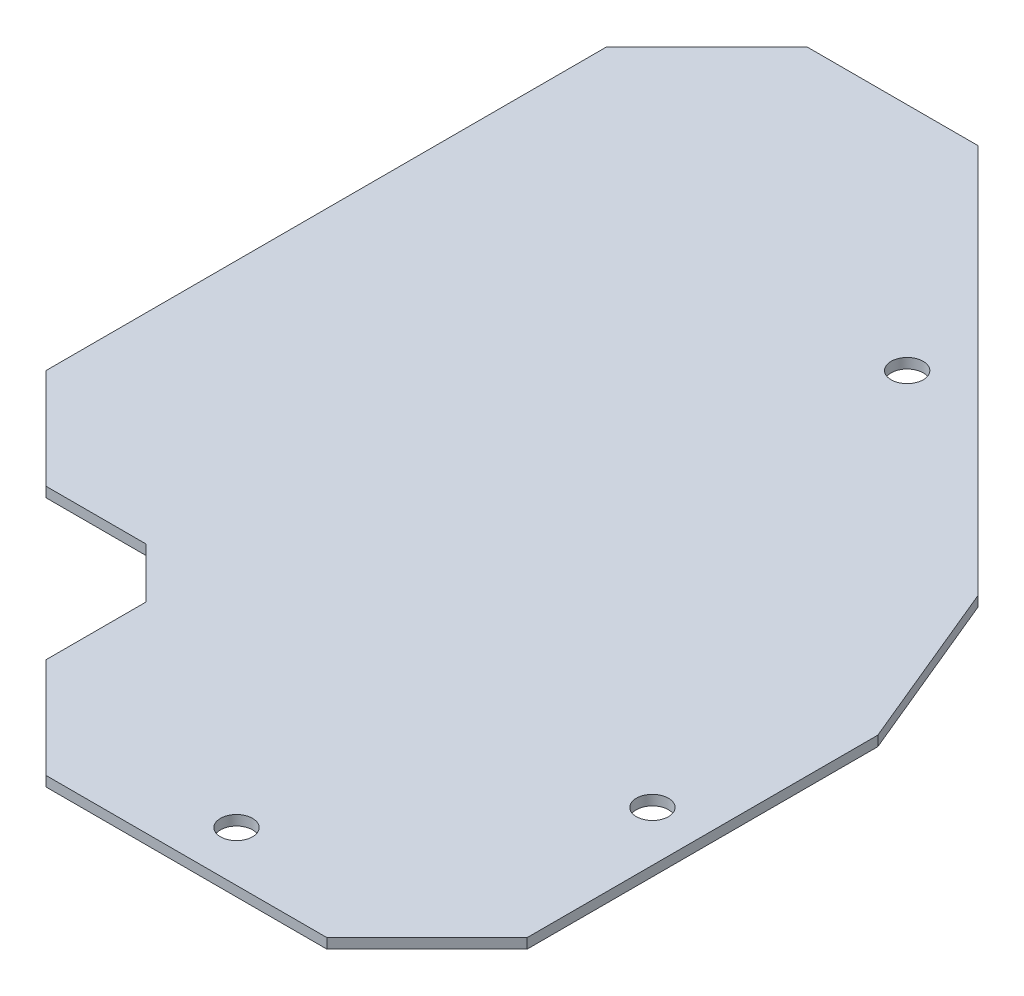
ISO-10303-21;
HEADER;
FILE_DESCRIPTION(('STEP AP214'),'2;1');
FILE_NAME('part.step','',(''),(''),'','','');
FILE_SCHEMA(('AUTOMOTIVE_DESIGN { 1 0 10303 214 1 1 1 1 }'));
ENDSEC;
DATA;
#1=APPLICATION_CONTEXT('core data for automotive mechanical design processes');
#2=APPLICATION_PROTOCOL_DEFINITION('international standard','automotive_design',2000,#1);
#3=PRODUCT_CONTEXT('',#1,'mechanical');
#4=PRODUCT('Part','Part','',(#3));
#5=PRODUCT_RELATED_PRODUCT_CATEGORY('part','',(#4));
#6=PRODUCT_DEFINITION_FORMATION('','',#4);
#7=PRODUCT_DEFINITION_CONTEXT('part definition',#1,'design');
#8=PRODUCT_DEFINITION('design','',#6,#7);
#9=PRODUCT_DEFINITION_SHAPE('','',#8);
#10=(LENGTH_UNIT() NAMED_UNIT(*) SI_UNIT(.MILLI.,.METRE.));
#11=(NAMED_UNIT(*) PLANE_ANGLE_UNIT() SI_UNIT($,.RADIAN.));
#12=(NAMED_UNIT(*) SI_UNIT($,.STERADIAN.) SOLID_ANGLE_UNIT());
#13=UNCERTAINTY_MEASURE_WITH_UNIT(LENGTH_MEASURE(1.E-05),#10,'distance_accuracy_value','');
#14=(GEOMETRIC_REPRESENTATION_CONTEXT(3) GLOBAL_UNCERTAINTY_ASSIGNED_CONTEXT((#13)) GLOBAL_UNIT_ASSIGNED_CONTEXT((#10,
#11,#12)) REPRESENTATION_CONTEXT('',''));
#15=CARTESIAN_POINT('',(0.,0.,0.));
#16=DIRECTION('',(0.,0.,1.));
#17=DIRECTION('',(1.,0.,0.));
#18=AXIS2_PLACEMENT_3D('',#15,#16,#17);
#19=CARTESIAN_POINT('',(0.,1.,0.));
#20=DIRECTION('',(0.,0.,-1.));
#21=DIRECTION('',(-1.,0.,0.));
#22=AXIS2_PLACEMENT_3D('',#19,#20,#21);
#23=PLANE('',#22);
#24=DIRECTION('',(1.,0.,0.));
#25=VECTOR('',#24,1.);
#26=CARTESIAN_POINT('',(0.,1.,0.));
#27=LINE('',#26,#25);
#28=CARTESIAN_POINT('',(15.,1.,0.));
#29=VERTEX_POINT('',#28);
#30=CARTESIAN_POINT('',(43.0330085889908,1.,0.));
#31=VERTEX_POINT('',#30);
#32=EDGE_CURVE('E230',#29,#31,#27,.T.);
#33=ORIENTED_EDGE('',*,*,#32,.F.);
#34=DIRECTION('',(0.,-1.,0.));
#35=VECTOR('',#34,1.);
#36=CARTESIAN_POINT('',(15.,1.,0.));
#37=LINE('',#36,#35);
#38=CARTESIAN_POINT('',(15.,0.,0.));
#39=VERTEX_POINT('',#38);
#40=EDGE_CURVE('E262',#29,#39,#37,.T.);
#41=ORIENTED_EDGE('',*,*,#40,.T.);
#42=DIRECTION('',(1.,0.,0.));
#43=VECTOR('',#42,1.);
#44=CARTESIAN_POINT('',(0.,0.,0.));
#45=LINE('',#44,#43);
#46=CARTESIAN_POINT('',(43.0330085889908,0.,0.));
#47=VERTEX_POINT('',#46);
#48=EDGE_CURVE('E226',#39,#47,#45,.T.);
#49=ORIENTED_EDGE('',*,*,#48,.T.);
#50=DIRECTION('',(0.,1.,0.));
#51=VECTOR('',#50,1.);
#52=CARTESIAN_POINT('',(43.0330085889908,1.,0.));
#53=LINE('',#52,#51);
#54=EDGE_CURVE('E257',#47,#31,#53,.T.);
#55=ORIENTED_EDGE('',*,*,#54,.T.);
#56=EDGE_LOOP('',(#33,#41,#49,#55));
#57=FACE_BOUND('',#56,.T.);
#58=ADVANCED_FACE('F43',(#57),#23,.F.);
#59=CARTESIAN_POINT('',(53.0330085889908,1.,0.));
#60=DIRECTION('',(-1.,0.,0.));
#61=DIRECTION('',(0.,0.,1.));
#62=AXIS2_PLACEMENT_3D('',#59,#60,#61);
#63=PLANE('',#62);
#64=DIRECTION('',(0.,0.,-1.));
#65=VECTOR('',#64,1.);
#66=CARTESIAN_POINT('',(53.0330085889908,0.,0.));
#67=LINE('',#66,#65);
#68=CARTESIAN_POINT('',(53.0330085889908,0.,-10.));
#69=VERTEX_POINT('',#68);
#70=CARTESIAN_POINT('',(53.0330085889908,0.,-44.9999999999999));
#71=VERTEX_POINT('',#70);
#72=EDGE_CURVE('E241',#69,#71,#67,.T.);
#73=ORIENTED_EDGE('',*,*,#72,.T.);
#74=DIRECTION('',(0.,1.,0.));
#75=VECTOR('',#74,1.);
#76=CARTESIAN_POINT('',(53.0330085889908,1.,-44.9999999999999));
#77=LINE('',#76,#75);
#78=CARTESIAN_POINT('',(53.0330085889908,1.,-44.9999999999999));
#79=VERTEX_POINT('',#78);
#80=EDGE_CURVE('E174',#71,#79,#77,.T.);
#81=ORIENTED_EDGE('',*,*,#80,.T.);
#82=DIRECTION('',(0.,0.,-1.));
#83=VECTOR('',#82,1.);
#84=CARTESIAN_POINT('',(53.0330085889908,1.,0.));
#85=LINE('',#84,#83);
#86=CARTESIAN_POINT('',(53.0330085889908,1.,-10.));
#87=VERTEX_POINT('',#86);
#88=EDGE_CURVE('E235',#87,#79,#85,.T.);
#89=ORIENTED_EDGE('',*,*,#88,.F.);
#90=DIRECTION('',(0.,-1.,0.));
#91=VECTOR('',#90,1.);
#92=CARTESIAN_POINT('',(53.0330085889908,1.,-10.));
#93=LINE('',#92,#91);
#94=EDGE_CURVE('E170',#87,#69,#93,.T.);
#95=ORIENTED_EDGE('',*,*,#94,.T.);
#96=EDGE_LOOP('',(#73,#81,#89,#95));
#97=FACE_BOUND('',#96,.T.);
#98=ADVANCED_FACE('F275',(#97),#63,.F.);
#99=CARTESIAN_POINT('',(53.0330085889908,1.,-55.));
#100=DIRECTION('',(-0.707106781186552,0.,0.707106781186544));
#101=DIRECTION('',(0.707106781186544,0.,0.707106781186552));
#102=AXIS2_PLACEMENT_3D('',#99,#100,#101);
#103=PLANE('',#102);
#104=DIRECTION('',(-0.707106781186544,0.,-0.707106781186552));
#105=VECTOR('',#104,1.);
#106=CARTESIAN_POINT('',(53.0330085889908,1.,-55.));
#107=LINE('',#106,#105);
#108=CARTESIAN_POINT('',(45.9619407771253,1.,-62.0710678118656));
#109=VERTEX_POINT('',#108);
#110=CARTESIAN_POINT('',(7.07106781186549,1.,-100.961940777126));
#111=VERTEX_POINT('',#110);
#112=EDGE_CURVE('E236',#109,#111,#107,.T.);
#113=ORIENTED_EDGE('',*,*,#112,.F.);
#114=DIRECTION('',(0.,-1.,0.));
#115=VECTOR('',#114,1.);
#116=CARTESIAN_POINT('',(45.9619407771253,1.,-62.0710678118656));
#117=LINE('',#116,#115);
#118=CARTESIAN_POINT('',(45.9619407771253,0.,-62.0710678118656));
#119=VERTEX_POINT('',#118);
#120=EDGE_CURVE('E147',#109,#119,#117,.T.);
#121=ORIENTED_EDGE('',*,*,#120,.T.);
#122=DIRECTION('',(-0.707106781186544,0.,-0.707106781186552));
#123=VECTOR('',#122,1.);
#124=CARTESIAN_POINT('',(53.0330085889908,0.,-55.));
#125=LINE('',#124,#123);
#126=CARTESIAN_POINT('',(7.07106781186549,0.,-100.961940777126));
#127=VERTEX_POINT('',#126);
#128=EDGE_CURVE('E231',#119,#127,#125,.T.);
#129=ORIENTED_EDGE('',*,*,#128,.T.);
#130=DIRECTION('',(0.,1.,0.));
#131=VECTOR('',#130,1.);
#132=CARTESIAN_POINT('',(7.07106781186549,1.,-100.961940777126));
#133=LINE('',#132,#131);
#134=EDGE_CURVE('E252',#127,#111,#133,.T.);
#135=ORIENTED_EDGE('',*,*,#134,.T.);
#136=EDGE_LOOP('',(#113,#121,#129,#135));
#137=FACE_BOUND('',#136,.T.);
#138=ADVANCED_FACE('F283',(#137),#103,.F.);
#139=CARTESIAN_POINT('',(0.,1.,0.));
#140=DIRECTION('',(0.,1.,0.));
#141=DIRECTION('',(0.,0.,1.));
#142=AXIS2_PLACEMENT_3D('',#139,#140,#141);
#143=PLANE('',#142);
#144=CARTESIAN_POINT('',(22.9809703885626,0.999999999999999,-77.980970388563));
#145=DIRECTION('',(0.,1.,0.));
#146=DIRECTION('',(0.,0.,1.));
#147=AXIS2_PLACEMENT_3D('',#144,#145,#146);
#148=CIRCLE('',#147,1.6);
#149=CARTESIAN_POINT('',(22.9809703885626,0.999999999999999,-76.380970388563));
#150=VERTEX_POINT('',#149);
#151=EDGE_CURVE('E220',#150,#150,#148,.T.);
#152=ORIENTED_EDGE('',*,*,#151,.F.);
#153=EDGE_LOOP('',(#152));
#154=FACE_BOUND('',#153,.T.);
#155=CARTESIAN_POINT('',(48.0330085889908,0.999999999999999,-27.5));
#156=DIRECTION('',(0.,1.,0.));
#157=DIRECTION('',(0.,0.,1.));
#158=AXIS2_PLACEMENT_3D('',#155,#156,#157);
#159=CIRCLE('',#158,1.6);
#160=CARTESIAN_POINT('',(48.0330085889908,0.999999999999999,-25.9));
#161=VERTEX_POINT('',#160);
#162=EDGE_CURVE('E217',#161,#161,#159,.T.);
#163=ORIENTED_EDGE('',*,*,#162,.F.);
#164=EDGE_LOOP('',(#163));
#165=FACE_BOUND('',#164,.T.);
#166=CARTESIAN_POINT('',(29.0165042944954,0.999999999999999,-5.));
#167=DIRECTION('',(0.,1.,0.));
#168=DIRECTION('',(0.,0.,1.));
#169=AXIS2_PLACEMENT_3D('',#166,#167,#168);
#170=CIRCLE('',#169,1.6);
#171=CARTESIAN_POINT('',(29.0165042944954,0.999999999999999,-3.4));
#172=VERTEX_POINT('',#171);
#173=EDGE_CURVE('E209',#172,#172,#170,.T.);
#174=ORIENTED_EDGE('',*,*,#173,.F.);
#175=EDGE_LOOP('',(#174));
#176=FACE_BOUND('',#175,.T.);
#177=DIRECTION('',(0.,0.,-1.));
#178=VECTOR('',#177,1.);
#179=CARTESIAN_POINT('',(-20.,1.,-100.961940777126));
#180=LINE('',#179,#178);
#181=CARTESIAN_POINT('',(-20.,1.,-34.9999999999999));
#182=VERTEX_POINT('',#181);
#183=CARTESIAN_POINT('',(-20.,1.,-90.9619407771256));
#184=VERTEX_POINT('',#183);
#185=EDGE_CURVE('E156',#182,#184,#180,.T.);
#186=ORIENTED_EDGE('',*,*,#185,.F.);
#187=DIRECTION('',(-0.707106781186546,0.,-0.707106781186549));
#188=VECTOR('',#187,1.);
#189=CARTESIAN_POINT('',(7.49999999999994,1.,-7.49999999999991));
#190=LINE('',#189,#188);
#191=CARTESIAN_POINT('',(-9.99999999999996,1.,-24.9999999999999));
#192=VERTEX_POINT('',#191);
#193=EDGE_CURVE('E55',#182,#192,#190,.F.);
#194=ORIENTED_EDGE('',*,*,#193,.T.);
#195=DIRECTION('',(-1.,0.,0.));
#196=VECTOR('',#195,1.);
#197=CARTESIAN_POINT('',(0.,1.,-24.9999999999999));
#198=LINE('',#197,#196);
#199=CARTESIAN_POINT('',(0.,1.,-24.9999999999999));
#200=VERTEX_POINT('',#199);
#201=EDGE_CURVE('E154',#200,#192,#198,.T.);
#202=ORIENTED_EDGE('',*,*,#201,.F.);
#203=DIRECTION('',(-0.707106781186544,0.,-0.707106781186551));
#204=VECTOR('',#203,1.);
#205=CARTESIAN_POINT('',(5.,0.999999999999999,-19.9999999999998));
#206=LINE('',#205,#204);
#207=CARTESIAN_POINT('',(5.,1.,-19.9999999999998));
#208=VERTEX_POINT('',#207);
#209=EDGE_CURVE('E138',#200,#208,#206,.F.);
#210=ORIENTED_EDGE('',*,*,#209,.T.);
#211=DIRECTION('',(0.,0.,-1.));
#212=VECTOR('',#211,1.);
#213=CARTESIAN_POINT('',(5.,1.,0.));
#214=LINE('',#213,#212);
#215=CARTESIAN_POINT('',(5.,1.,-10.));
#216=VERTEX_POINT('',#215);
#217=EDGE_CURVE('E228',#216,#208,#214,.T.);
#218=ORIENTED_EDGE('',*,*,#217,.F.);
#219=DIRECTION('',(-0.707106781186547,0.,-0.707106781186549));
#220=VECTOR('',#219,1.);
#221=CARTESIAN_POINT('',(7.50000000000002,1.,-7.5));
#222=LINE('',#221,#220);
#223=EDGE_CURVE('E259',#216,#29,#222,.F.);
#224=ORIENTED_EDGE('',*,*,#223,.T.);
#225=ORIENTED_EDGE('',*,*,#32,.T.);
#226=DIRECTION('',(-0.707106781186549,0.,0.707106781186547));
#227=VECTOR('',#226,1.);
#228=CARTESIAN_POINT('',(21.5165042944953,1.,21.5165042944954));
#229=LINE('',#228,#227);
#230=EDGE_CURVE('E251',#31,#87,#229,.F.);
#231=ORIENTED_EDGE('',*,*,#230,.T.);
#232=ORIENTED_EDGE('',*,*,#88,.T.);
#233=DIRECTION('',(0.382683432365086,0.,0.923879532511288));
#234=VECTOR('',#233,1.);
#235=CARTESIAN_POINT('',(61.1764068711926,1.,-25.3400974233023));
#236=LINE('',#235,#234);
#237=EDGE_CURVE('E180',#79,#109,#236,.F.);
#238=ORIENTED_EDGE('',*,*,#237,.T.);
#239=ORIENTED_EDGE('',*,*,#112,.T.);
#240=DIRECTION('',(1.,0.,0.));
#241=VECTOR('',#240,1.);
#242=CARTESIAN_POINT('',(-1.18889686371183E-12,1.,-100.961940777126));
#243=LINE('',#242,#241);
#244=CARTESIAN_POINT('',(-10.0000000000002,1.,-100.961940777126));
#245=VERTEX_POINT('',#244);
#246=EDGE_CURVE('E260',#111,#245,#243,.F.);
#247=ORIENTED_EDGE('',*,*,#246,.T.);
#248=DIRECTION('',(-0.707106781186541,0.,0.707106781186554));
#249=VECTOR('',#248,1.);
#250=CARTESIAN_POINT('',(-55.480970388563,1.,-55.4809703885619));
#251=LINE('',#250,#249);
#252=EDGE_CURVE('E63',#245,#184,#251,.T.);
#253=ORIENTED_EDGE('',*,*,#252,.T.);
#254=EDGE_LOOP('',(#186,#194,#202,#210,#218,#224,#225,#231,#232,#238,#239,#247,#253));
#255=FACE_BOUND('',#254,.T.);
#256=ADVANCED_FACE('F153',(#154,#165,#176,#255),#143,.T.);
#257=CARTESIAN_POINT('',(0.,0.,0.));
#258=DIRECTION('',(0.,1.,0.));
#259=DIRECTION('',(0.,0.,1.));
#260=AXIS2_PLACEMENT_3D('',#257,#258,#259);
#261=PLANE('',#260);
#262=CARTESIAN_POINT('',(22.9809703885626,0.,-77.980970388563));
#263=DIRECTION('',(0.,-1.,0.));
#264=DIRECTION('',(0.,0.,-1.));
#265=AXIS2_PLACEMENT_3D('',#262,#263,#264);
#266=CIRCLE('',#265,1.6);
#267=CARTESIAN_POINT('',(22.9809703885626,0.,-79.580970388563));
#268=VERTEX_POINT('',#267);
#269=EDGE_CURVE('E207',#268,#268,#266,.T.);
#270=ORIENTED_EDGE('',*,*,#269,.F.);
#271=EDGE_LOOP('',(#270));
#272=FACE_BOUND('',#271,.T.);
#273=CARTESIAN_POINT('',(48.0330085889908,0.,-27.5));
#274=DIRECTION('',(0.,-1.,0.));
#275=DIRECTION('',(0.,0.,-1.));
#276=AXIS2_PLACEMENT_3D('',#273,#274,#275);
#277=CIRCLE('',#276,1.6);
#278=CARTESIAN_POINT('',(48.0330085889908,0.,-29.0999999999999));
#279=VERTEX_POINT('',#278);
#280=EDGE_CURVE('E208',#279,#279,#277,.T.);
#281=ORIENTED_EDGE('',*,*,#280,.F.);
#282=EDGE_LOOP('',(#281));
#283=FACE_BOUND('',#282,.T.);
#284=CARTESIAN_POINT('',(29.0165042944954,0.,-5.));
#285=DIRECTION('',(0.,-1.,0.));
#286=DIRECTION('',(0.,0.,-1.));
#287=AXIS2_PLACEMENT_3D('',#284,#285,#286);
#288=CIRCLE('',#287,1.6);
#289=CARTESIAN_POINT('',(29.0165042944954,0.,-6.6));
#290=VERTEX_POINT('',#289);
#291=EDGE_CURVE('E197',#290,#290,#288,.T.);
#292=ORIENTED_EDGE('',*,*,#291,.F.);
#293=EDGE_LOOP('',(#292));
#294=FACE_BOUND('',#293,.T.);
#295=DIRECTION('',(-1.,0.,0.));
#296=VECTOR('',#295,1.);
#297=CARTESIAN_POINT('',(0.,0.,-24.9999999999999));
#298=LINE('',#297,#296);
#299=CARTESIAN_POINT('',(0.,0.,-24.9999999999999));
#300=VERTEX_POINT('',#299);
#301=CARTESIAN_POINT('',(-9.99999999999996,0.,-24.9999999999999));
#302=VERTEX_POINT('',#301);
#303=EDGE_CURVE('E165',#300,#302,#298,.T.);
#304=ORIENTED_EDGE('',*,*,#303,.T.);
#305=DIRECTION('',(0.707106781186546,0.,0.707106781186549));
#306=VECTOR('',#305,1.);
#307=CARTESIAN_POINT('',(-9.99999999999996,0.,-24.9999999999999));
#308=LINE('',#307,#306);
#309=CARTESIAN_POINT('',(-20.,0.,-34.9999999999999));
#310=VERTEX_POINT('',#309);
#311=EDGE_CURVE('E182',#302,#310,#308,.F.);
#312=ORIENTED_EDGE('',*,*,#311,.T.);
#313=DIRECTION('',(0.,0.,-1.));
#314=VECTOR('',#313,1.);
#315=CARTESIAN_POINT('',(-20.,0.,-100.961940777126));
#316=LINE('',#315,#314);
#317=CARTESIAN_POINT('',(-20.,0.,-90.9619407771256));
#318=VERTEX_POINT('',#317);
#319=EDGE_CURVE('E158',#310,#318,#316,.T.);
#320=ORIENTED_EDGE('',*,*,#319,.T.);
#321=DIRECTION('',(0.707106781186541,0.,-0.707106781186554));
#322=VECTOR('',#321,1.);
#323=CARTESIAN_POINT('',(-20.,0.,-90.9619407771256));
#324=LINE('',#323,#322);
#325=CARTESIAN_POINT('',(-10.0000000000002,0.,-100.961940777126));
#326=VERTEX_POINT('',#325);
#327=EDGE_CURVE('E181',#318,#326,#324,.T.);
#328=ORIENTED_EDGE('',*,*,#327,.T.);
#329=DIRECTION('',(-1.,0.,0.));
#330=VECTOR('',#329,1.);
#331=CARTESIAN_POINT('',(0.,0.,-100.961940777126));
#332=LINE('',#331,#330);
#333=EDGE_CURVE('E248',#326,#127,#332,.F.);
#334=ORIENTED_EDGE('',*,*,#333,.T.);
#335=ORIENTED_EDGE('',*,*,#128,.F.);
#336=DIRECTION('',(-0.382683432365086,0.,-0.923879532511288));
#337=VECTOR('',#336,1.);
#338=CARTESIAN_POINT('',(45.9619407771253,0.,-62.0710678118656));
#339=LINE('',#338,#337);
#340=EDGE_CURVE('E173',#119,#71,#339,.F.);
#341=ORIENTED_EDGE('',*,*,#340,.T.);
#342=ORIENTED_EDGE('',*,*,#72,.F.);
#343=DIRECTION('',(0.707106781186549,0.,-0.707106781186547));
#344=VECTOR('',#343,1.);
#345=CARTESIAN_POINT('',(53.0330085889908,0.,-10.));
#346=LINE('',#345,#344);
#347=EDGE_CURVE('E238',#69,#47,#346,.F.);
#348=ORIENTED_EDGE('',*,*,#347,.T.);
#349=ORIENTED_EDGE('',*,*,#48,.F.);
#350=DIRECTION('',(0.707106781186547,0.,0.707106781186549));
#351=VECTOR('',#350,1.);
#352=CARTESIAN_POINT('',(15.,0.,0.));
#353=LINE('',#352,#351);
#354=CARTESIAN_POINT('',(5.,0.,-10.));
#355=VERTEX_POINT('',#354);
#356=EDGE_CURVE('E250',#39,#355,#353,.F.);
#357=ORIENTED_EDGE('',*,*,#356,.T.);
#358=DIRECTION('',(0.,0.,1.));
#359=VECTOR('',#358,1.);
#360=CARTESIAN_POINT('',(5.,0.,-30.));
#361=LINE('',#360,#359);
#362=CARTESIAN_POINT('',(5.,0.,-19.9999999999998));
#363=VERTEX_POINT('',#362);
#364=EDGE_CURVE('E224',#363,#355,#361,.T.);
#365=ORIENTED_EDGE('',*,*,#364,.F.);
#366=DIRECTION('',(0.707106781186544,0.,0.707106781186551));
#367=VECTOR('',#366,1.);
#368=CARTESIAN_POINT('',(12.4999999999999,0.,-12.4999999999998));
#369=LINE('',#368,#367);
#370=EDGE_CURVE('E164',#363,#300,#369,.F.);
#371=ORIENTED_EDGE('',*,*,#370,.T.);
#372=EDGE_LOOP('',(#304,#312,#320,#328,#334,#335,#341,#342,#348,#349,#357,#365,#371));
#373=FACE_BOUND('',#372,.T.);
#374=ADVANCED_FACE('F202',(#272,#283,#294,#373),#261,.F.);
#375=CARTESIAN_POINT('',(5.,10.,-30.));
#376=DIRECTION('',(1.,0.,0.));
#377=DIRECTION('',(0.,0.,-1.));
#378=AXIS2_PLACEMENT_3D('',#375,#376,#377);
#379=PLANE('',#378);
#380=ORIENTED_EDGE('',*,*,#364,.T.);
#381=DIRECTION('',(0.,1.,0.));
#382=VECTOR('',#381,1.);
#383=CARTESIAN_POINT('',(5.,10.,-10.));
#384=LINE('',#383,#382);
#385=EDGE_CURVE('E267',#355,#216,#384,.T.);
#386=ORIENTED_EDGE('',*,*,#385,.T.);
#387=ORIENTED_EDGE('',*,*,#217,.T.);
#388=DIRECTION('',(0.,-1.,0.));
#389=VECTOR('',#388,1.);
#390=CARTESIAN_POINT('',(5.,0.,-19.9999999999998));
#391=LINE('',#390,#389);
#392=EDGE_CURVE('E146',#208,#363,#391,.T.);
#393=ORIENTED_EDGE('',*,*,#392,.T.);
#394=EDGE_LOOP('',(#380,#386,#387,#393));
#395=FACE_BOUND('',#394,.T.);
#396=ADVANCED_FACE('F295',(#395),#379,.F.);
#397=CARTESIAN_POINT('',(0.,1.,-100.961940777126));
#398=DIRECTION('',(0.,0.,1.));
#399=DIRECTION('',(0.,-1.,0.));
#400=AXIS2_PLACEMENT_3D('',#397,#398,#399);
#401=PLANE('',#400);
#402=ORIENTED_EDGE('',*,*,#333,.F.);
#403=DIRECTION('',(0.,-1.,0.));
#404=VECTOR('',#403,1.);
#405=CARTESIAN_POINT('',(-10.0000000000002,1.,-100.961940777126));
#406=LINE('',#405,#404);
#407=EDGE_CURVE('E11',#326,#245,#406,.F.);
#408=ORIENTED_EDGE('',*,*,#407,.T.);
#409=ORIENTED_EDGE('',*,*,#246,.F.);
#410=ORIENTED_EDGE('',*,*,#134,.F.);
#411=EDGE_LOOP('',(#402,#408,#409,#410));
#412=FACE_BOUND('',#411,.T.);
#413=ADVANCED_FACE('F296',(#412),#401,.F.);
#414=CARTESIAN_POINT('',(15.,1.,0.));
#415=DIRECTION('',(0.707106781186548,0.,-0.707106781186546));
#416=DIRECTION('',(0.,-1.,0.));
#417=AXIS2_PLACEMENT_3D('',#414,#415,#416);
#418=PLANE('',#417);
#419=ORIENTED_EDGE('',*,*,#223,.F.);
#420=ORIENTED_EDGE('',*,*,#385,.F.);
#421=ORIENTED_EDGE('',*,*,#356,.F.);
#422=ORIENTED_EDGE('',*,*,#40,.F.);
#423=EDGE_LOOP('',(#419,#420,#421,#422));
#424=FACE_BOUND('',#423,.T.);
#425=ADVANCED_FACE('F298',(#424),#418,.F.);
#426=CARTESIAN_POINT('',(5.,10.,-19.9999999999998));
#427=DIRECTION('',(-0.707106781186551,0.,0.707106781186544));
#428=DIRECTION('',(0.,1.,0.));
#429=AXIS2_PLACEMENT_3D('',#426,#427,#428);
#430=PLANE('',#429);
#431=ORIENTED_EDGE('',*,*,#209,.F.);
#432=DIRECTION('',(0.,-1.,0.));
#433=VECTOR('',#432,1.);
#434=CARTESIAN_POINT('',(0.,1.,-24.9999999999999));
#435=LINE('',#434,#433);
#436=EDGE_CURVE('E144',#300,#200,#435,.F.);
#437=ORIENTED_EDGE('',*,*,#436,.F.);
#438=ORIENTED_EDGE('',*,*,#370,.F.);
#439=ORIENTED_EDGE('',*,*,#392,.F.);
#440=EDGE_LOOP('',(#431,#437,#438,#439));
#441=FACE_BOUND('',#440,.T.);
#442=ADVANCED_FACE('F145',(#441),#430,.T.);
#443=CARTESIAN_POINT('',(53.0330085889908,1.,-10.));
#444=DIRECTION('',(-0.707106781186547,0.,-0.707106781186549));
#445=DIRECTION('',(0.,-1.,0.));
#446=AXIS2_PLACEMENT_3D('',#443,#444,#445);
#447=PLANE('',#446);
#448=ORIENTED_EDGE('',*,*,#230,.F.);
#449=ORIENTED_EDGE('',*,*,#54,.F.);
#450=ORIENTED_EDGE('',*,*,#347,.F.);
#451=ORIENTED_EDGE('',*,*,#94,.F.);
#452=EDGE_LOOP('',(#448,#449,#450,#451));
#453=FACE_BOUND('',#452,.T.);
#454=ADVANCED_FACE('F289',(#453),#447,.F.);
#455=CARTESIAN_POINT('',(45.9619407771253,1.,-62.0710678118656));
#456=DIRECTION('',(-0.923879532511288,0.,0.382683432365086));
#457=DIRECTION('',(0.,-1.,0.));
#458=AXIS2_PLACEMENT_3D('',#455,#456,#457);
#459=PLANE('',#458);
#460=ORIENTED_EDGE('',*,*,#237,.F.);
#461=ORIENTED_EDGE('',*,*,#80,.F.);
#462=ORIENTED_EDGE('',*,*,#340,.F.);
#463=ORIENTED_EDGE('',*,*,#120,.F.);
#464=EDGE_LOOP('',(#460,#461,#462,#463));
#465=FACE_BOUND('',#464,.T.);
#466=ADVANCED_FACE('F281',(#465),#459,.F.);
#467=CARTESIAN_POINT('',(29.0165042944954,10.,-5.));
#468=DIRECTION('',(0.,-1.,0.));
#469=DIRECTION('',(0.,0.,-1.));
#470=AXIS2_PLACEMENT_3D('',#467,#468,#469);
#471=CYLINDRICAL_SURFACE('',#470,1.6);
#472=ORIENTED_EDGE('',*,*,#173,.T.);
#473=EDGE_LOOP('',(#472));
#474=FACE_BOUND('',#473,.T.);
#475=ORIENTED_EDGE('',*,*,#291,.T.);
#476=EDGE_LOOP('',(#475));
#477=FACE_BOUND('',#476,.T.);
#478=ADVANCED_FACE('F358',(#474,#477),#471,.F.);
#479=CARTESIAN_POINT('',(48.0330085889908,10.,-27.5));
#480=DIRECTION('',(0.,-1.,0.));
#481=DIRECTION('',(0.,0.,-1.));
#482=AXIS2_PLACEMENT_3D('',#479,#480,#481);
#483=CYLINDRICAL_SURFACE('',#482,1.6);
#484=ORIENTED_EDGE('',*,*,#162,.T.);
#485=EDGE_LOOP('',(#484));
#486=FACE_BOUND('',#485,.T.);
#487=ORIENTED_EDGE('',*,*,#280,.T.);
#488=EDGE_LOOP('',(#487));
#489=FACE_BOUND('',#488,.T.);
#490=ADVANCED_FACE('F355',(#486,#489),#483,.F.);
#491=CARTESIAN_POINT('',(22.9809703885626,10.,-77.980970388563));
#492=DIRECTION('',(0.,-1.,0.));
#493=DIRECTION('',(0.,0.,-1.));
#494=AXIS2_PLACEMENT_3D('',#491,#492,#493);
#495=CYLINDRICAL_SURFACE('',#494,1.6);
#496=ORIENTED_EDGE('',*,*,#151,.T.);
#497=EDGE_LOOP('',(#496));
#498=FACE_BOUND('',#497,.T.);
#499=ORIENTED_EDGE('',*,*,#269,.T.);
#500=EDGE_LOOP('',(#499));
#501=FACE_BOUND('',#500,.T.);
#502=ADVANCED_FACE('F347',(#498,#501),#495,.F.);
#503=CARTESIAN_POINT('',(0.,79.5507253093667,-24.9999999999999));
#504=DIRECTION('',(0.,0.,1.));
#505=DIRECTION('',(1.,0.,0.));
#506=AXIS2_PLACEMENT_3D('',#503,#504,#505);
#507=PLANE('',#506);
#508=ORIENTED_EDGE('',*,*,#201,.T.);
#509=DIRECTION('',(0.,-1.,0.));
#510=VECTOR('',#509,1.);
#511=CARTESIAN_POINT('',(-9.99999999999996,79.5507253093667,-24.9999999999999));
#512=LINE('',#511,#510);
#513=EDGE_CURVE('E177',#192,#302,#512,.T.);
#514=ORIENTED_EDGE('',*,*,#513,.T.);
#515=ORIENTED_EDGE('',*,*,#303,.F.);
#516=ORIENTED_EDGE('',*,*,#436,.T.);
#517=EDGE_LOOP('',(#508,#514,#515,#516));
#518=FACE_BOUND('',#517,.T.);
#519=ADVANCED_FACE('F162',(#518),#507,.T.);
#520=CARTESIAN_POINT('',(-20.,79.5507253093667,-100.961940777126));
#521=DIRECTION('',(-1.,0.,0.));
#522=DIRECTION('',(0.,0.,1.));
#523=AXIS2_PLACEMENT_3D('',#520,#521,#522);
#524=PLANE('',#523);
#525=ORIENTED_EDGE('',*,*,#319,.F.);
#526=DIRECTION('',(0.,1.,0.));
#527=VECTOR('',#526,1.);
#528=CARTESIAN_POINT('',(-20.,79.5507253093667,-34.9999999999999));
#529=LINE('',#528,#527);
#530=EDGE_CURVE('E189',#310,#182,#529,.T.);
#531=ORIENTED_EDGE('',*,*,#530,.T.);
#532=ORIENTED_EDGE('',*,*,#185,.T.);
#533=DIRECTION('',(0.,-1.,0.));
#534=VECTOR('',#533,1.);
#535=CARTESIAN_POINT('',(-20.,79.5507253093667,-90.9619407771256));
#536=LINE('',#535,#534);
#537=EDGE_CURVE('E184',#184,#318,#536,.T.);
#538=ORIENTED_EDGE('',*,*,#537,.T.);
#539=EDGE_LOOP('',(#525,#531,#532,#538));
#540=FACE_BOUND('',#539,.T.);
#541=ADVANCED_FACE('F195',(#540),#524,.T.);
#542=CARTESIAN_POINT('',(-9.99999999999996,79.5507253093667,-24.9999999999999));
#543=DIRECTION('',(0.707106781186549,0.,-0.707106781186546));
#544=DIRECTION('',(0.,-1.,0.));
#545=AXIS2_PLACEMENT_3D('',#542,#543,#544);
#546=PLANE('',#545);
#547=ORIENTED_EDGE('',*,*,#193,.F.);
#548=ORIENTED_EDGE('',*,*,#530,.F.);
#549=ORIENTED_EDGE('',*,*,#311,.F.);
#550=ORIENTED_EDGE('',*,*,#513,.F.);
#551=EDGE_LOOP('',(#547,#548,#549,#550));
#552=FACE_BOUND('',#551,.T.);
#553=ADVANCED_FACE('F198',(#552),#546,.F.);
#554=CARTESIAN_POINT('',(-20.,79.5507253093667,-90.9619407771256));
#555=DIRECTION('',(-0.707106781186554,0.,-0.707106781186541));
#556=DIRECTION('',(0.,1.,0.));
#557=AXIS2_PLACEMENT_3D('',#554,#555,#556);
#558=PLANE('',#557);
#559=ORIENTED_EDGE('',*,*,#252,.F.);
#560=ORIENTED_EDGE('',*,*,#407,.F.);
#561=ORIENTED_EDGE('',*,*,#327,.F.);
#562=ORIENTED_EDGE('',*,*,#537,.F.);
#563=EDGE_LOOP('',(#559,#560,#561,#562));
#564=FACE_BOUND('',#563,.T.);
#565=ADVANCED_FACE('F46',(#564),#558,.T.);
#566=CLOSED_SHELL('',(#58,#98,#138,#256,#374,#396,#413,#425,#442,#454,#466,#478,#490,#502,#519,
#541,#553,#565));
#567=MANIFOLD_SOLID_BREP('B2',#566);
#568=ADVANCED_BREP_SHAPE_REPRESENTATION('',(#18,#567),#14);
#569=SHAPE_DEFINITION_REPRESENTATION(#9,#568);
ENDSEC;
END-ISO-10303-21;
